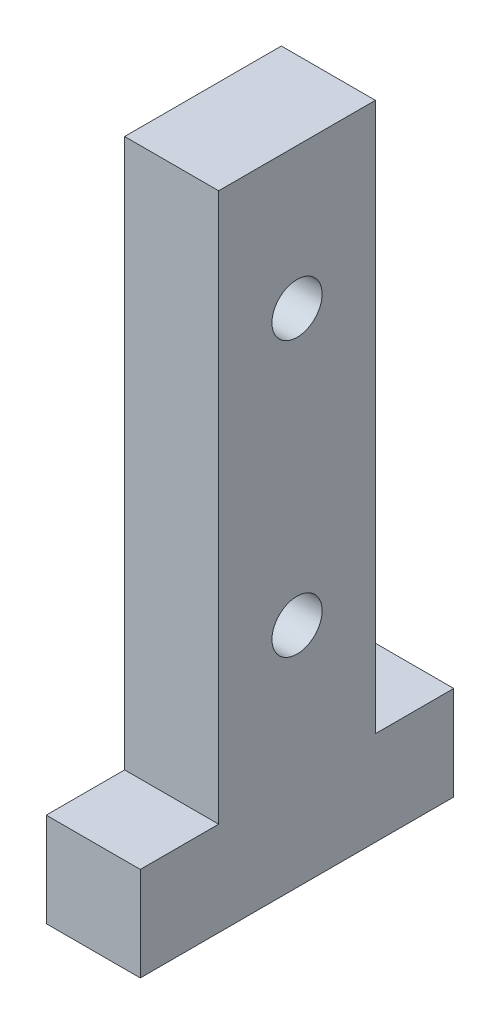
ISO-10303-21;
HEADER;
FILE_DESCRIPTION(('STEP AP214'),'2;1');
FILE_NAME('part.step','',(''),(''),'','','');
FILE_SCHEMA(('AUTOMOTIVE_DESIGN { 1 0 10303 214 1 1 1 1 }'));
ENDSEC;
DATA;
#1=APPLICATION_CONTEXT('core data for automotive mechanical design processes');
#2=APPLICATION_PROTOCOL_DEFINITION('international standard','automotive_design',2000,#1);
#3=PRODUCT_CONTEXT('',#1,'mechanical');
#4=PRODUCT('Part','Part','',(#3));
#5=PRODUCT_RELATED_PRODUCT_CATEGORY('part','',(#4));
#6=PRODUCT_DEFINITION_FORMATION('','',#4);
#7=PRODUCT_DEFINITION_CONTEXT('part definition',#1,'design');
#8=PRODUCT_DEFINITION('design','',#6,#7);
#9=PRODUCT_DEFINITION_SHAPE('','',#8);
#10=(LENGTH_UNIT() NAMED_UNIT(*) SI_UNIT(.MILLI.,.METRE.));
#11=(NAMED_UNIT(*) PLANE_ANGLE_UNIT() SI_UNIT($,.RADIAN.));
#12=(NAMED_UNIT(*) SI_UNIT($,.STERADIAN.) SOLID_ANGLE_UNIT());
#13=UNCERTAINTY_MEASURE_WITH_UNIT(LENGTH_MEASURE(1.E-05),#10,'distance_accuracy_value','');
#14=(GEOMETRIC_REPRESENTATION_CONTEXT(3) GLOBAL_UNCERTAINTY_ASSIGNED_CONTEXT((#13)) GLOBAL_UNIT_ASSIGNED_CONTEXT((#10,
#11,#12)) REPRESENTATION_CONTEXT('',''));
#15=CARTESIAN_POINT('',(0.,0.,0.));
#16=DIRECTION('',(0.,0.,1.));
#17=DIRECTION('',(1.,0.,0.));
#18=AXIS2_PLACEMENT_3D('',#15,#16,#17);
#19=CARTESIAN_POINT('',(6.,0.,0.));
#20=DIRECTION('',(-1.,0.,0.));
#21=DIRECTION('',(0.,0.,1.));
#22=AXIS2_PLACEMENT_3D('',#19,#20,#21);
#23=PLANE('',#22);
#24=DIRECTION('',(0.,-1.,0.));
#25=VECTOR('',#24,1.);
#26=CARTESIAN_POINT('',(6.,0.,10.));
#27=LINE('',#26,#25);
#28=CARTESIAN_POINT('',(6.,6.,10.));
#29=VERTEX_POINT('',#28);
#30=CARTESIAN_POINT('',(6.,0.,10.));
#31=VERTEX_POINT('',#30);
#32=EDGE_CURVE('E170',#29,#31,#27,.T.);
#33=ORIENTED_EDGE('',*,*,#32,.T.);
#34=DIRECTION('',(0.,0.,-1.));
#35=VECTOR('',#34,1.);
#36=CARTESIAN_POINT('',(6.,0.,10.));
#37=LINE('',#36,#35);
#38=CARTESIAN_POINT('',(6.,0.,-10.));
#39=VERTEX_POINT('',#38);
#40=EDGE_CURVE('E106',#31,#39,#37,.T.);
#41=ORIENTED_EDGE('',*,*,#40,.T.);
#42=DIRECTION('',(0.,1.,0.));
#43=VECTOR('',#42,1.);
#44=CARTESIAN_POINT('',(6.,0.,-10.));
#45=LINE('',#44,#43);
#46=CARTESIAN_POINT('',(6.,6.,-10.));
#47=VERTEX_POINT('',#46);
#48=EDGE_CURVE('E191',#39,#47,#45,.T.);
#49=ORIENTED_EDGE('',*,*,#48,.T.);
#50=DIRECTION('',(0.,0.,1.));
#51=VECTOR('',#50,1.);
#52=CARTESIAN_POINT('',(6.,6.,-5.));
#53=LINE('',#52,#51);
#54=CARTESIAN_POINT('',(6.,6.,-5.));
#55=VERTEX_POINT('',#54);
#56=EDGE_CURVE('E205',#47,#55,#53,.T.);
#57=ORIENTED_EDGE('',*,*,#56,.T.);
#58=DIRECTION('',(0.,1.,0.));
#59=VECTOR('',#58,1.);
#60=CARTESIAN_POINT('',(6.,6.,-5.));
#61=LINE('',#60,#59);
#62=CARTESIAN_POINT('',(6.,41.,-5.));
#63=VERTEX_POINT('',#62);
#64=EDGE_CURVE('E125',#55,#63,#61,.T.);
#65=ORIENTED_EDGE('',*,*,#64,.T.);
#66=DIRECTION('',(0.,0.,1.));
#67=VECTOR('',#66,1.);
#68=CARTESIAN_POINT('',(6.,41.,5.));
#69=LINE('',#68,#67);
#70=CARTESIAN_POINT('',(6.,41.,5.));
#71=VERTEX_POINT('',#70);
#72=EDGE_CURVE('E119',#63,#71,#69,.T.);
#73=ORIENTED_EDGE('',*,*,#72,.T.);
#74=DIRECTION('',(0.,-1.,0.));
#75=VECTOR('',#74,1.);
#76=CARTESIAN_POINT('',(6.,6.,5.));
#77=LINE('',#76,#75);
#78=CARTESIAN_POINT('',(6.,6.,5.));
#79=VERTEX_POINT('',#78);
#80=EDGE_CURVE('E123',#71,#79,#77,.T.);
#81=ORIENTED_EDGE('',*,*,#80,.T.);
#82=DIRECTION('',(0.,0.,1.));
#83=VECTOR('',#82,1.);
#84=CARTESIAN_POINT('',(6.,6.,10.));
#85=LINE('',#84,#83);
#86=EDGE_CURVE('E63',#79,#29,#85,.T.);
#87=ORIENTED_EDGE('',*,*,#86,.T.);
#88=EDGE_LOOP('',(#33,#41,#49,#57,#65,#73,#81,#87));
#89=FACE_BOUND('',#88,.T.);
#90=CARTESIAN_POINT('',(6.,32.,1.82231204340011E-13));
#91=DIRECTION('',(1.,0.,0.));
#92=DIRECTION('',(0.,0.,-1.));
#93=AXIS2_PLACEMENT_3D('',#90,#91,#92);
#94=CIRCLE('',#93,1.6);
#95=CARTESIAN_POINT('',(6.,32.,-1.59999999999982));
#96=VERTEX_POINT('',#95);
#97=EDGE_CURVE('E152',#96,#96,#94,.T.);
#98=ORIENTED_EDGE('',*,*,#97,.F.);
#99=EDGE_LOOP('',(#98));
#100=FACE_BOUND('',#99,.T.);
#101=CARTESIAN_POINT('',(6.,14.5,0.));
#102=DIRECTION('',(1.,0.,0.));
#103=DIRECTION('',(0.,0.,-1.));
#104=AXIS2_PLACEMENT_3D('',#101,#102,#103);
#105=CIRCLE('',#104,1.6);
#106=CARTESIAN_POINT('',(6.,14.5,-1.6));
#107=VERTEX_POINT('',#106);
#108=EDGE_CURVE('E219',#107,#107,#105,.T.);
#109=ORIENTED_EDGE('',*,*,#108,.F.);
#110=EDGE_LOOP('',(#109));
#111=FACE_BOUND('',#110,.T.);
#112=ADVANCED_FACE('F45',(#89,#100,#111),#23,.F.);
#113=CARTESIAN_POINT('',(0.,0.,0.));
#114=DIRECTION('',(-1.,0.,0.));
#115=DIRECTION('',(0.,0.,1.));
#116=AXIS2_PLACEMENT_3D('',#113,#114,#115);
#117=PLANE('',#116);
#118=CARTESIAN_POINT('',(0.,32.,1.82231204340011E-13));
#119=DIRECTION('',(1.,0.,0.));
#120=DIRECTION('',(0.,0.,-1.));
#121=AXIS2_PLACEMENT_3D('',#118,#119,#120);
#122=CIRCLE('',#121,1.6);
#123=CARTESIAN_POINT('',(0.,32.,-1.59999999999982));
#124=VERTEX_POINT('',#123);
#125=EDGE_CURVE('E215',#124,#124,#122,.T.);
#126=ORIENTED_EDGE('',*,*,#125,.T.);
#127=EDGE_LOOP('',(#126));
#128=FACE_BOUND('',#127,.T.);
#129=DIRECTION('',(0.,-1.,0.));
#130=VECTOR('',#129,1.);
#131=CARTESIAN_POINT('',(0.,0.,10.));
#132=LINE('',#131,#130);
#133=CARTESIAN_POINT('',(0.,6.,10.));
#134=VERTEX_POINT('',#133);
#135=CARTESIAN_POINT('',(0.,0.,10.));
#136=VERTEX_POINT('',#135);
#137=EDGE_CURVE('E147',#134,#136,#132,.T.);
#138=ORIENTED_EDGE('',*,*,#137,.F.);
#139=DIRECTION('',(0.,0.,1.));
#140=VECTOR('',#139,1.);
#141=CARTESIAN_POINT('',(0.,6.,10.));
#142=LINE('',#141,#140);
#143=CARTESIAN_POINT('',(0.,6.,5.));
#144=VERTEX_POINT('',#143);
#145=EDGE_CURVE('E98',#144,#134,#142,.T.);
#146=ORIENTED_EDGE('',*,*,#145,.F.);
#147=DIRECTION('',(0.,-1.,0.));
#148=VECTOR('',#147,1.);
#149=CARTESIAN_POINT('',(0.,6.,5.));
#150=LINE('',#149,#148);
#151=CARTESIAN_POINT('',(0.,41.,5.));
#152=VERTEX_POINT('',#151);
#153=EDGE_CURVE('E92',#152,#144,#150,.T.);
#154=ORIENTED_EDGE('',*,*,#153,.F.);
#155=DIRECTION('',(0.,0.,1.));
#156=VECTOR('',#155,1.);
#157=CARTESIAN_POINT('',(0.,41.,5.));
#158=LINE('',#157,#156);
#159=CARTESIAN_POINT('',(0.,41.,-5.));
#160=VERTEX_POINT('',#159);
#161=EDGE_CURVE('E134',#160,#152,#158,.T.);
#162=ORIENTED_EDGE('',*,*,#161,.F.);
#163=DIRECTION('',(0.,1.,0.));
#164=VECTOR('',#163,1.);
#165=CARTESIAN_POINT('',(0.,6.,-5.));
#166=LINE('',#165,#164);
#167=CARTESIAN_POINT('',(0.,6.,-5.));
#168=VERTEX_POINT('',#167);
#169=EDGE_CURVE('E161',#168,#160,#166,.T.);
#170=ORIENTED_EDGE('',*,*,#169,.F.);
#171=DIRECTION('',(0.,0.,1.));
#172=VECTOR('',#171,1.);
#173=CARTESIAN_POINT('',(0.,6.,-5.));
#174=LINE('',#173,#172);
#175=CARTESIAN_POINT('',(0.,6.,-10.));
#176=VERTEX_POINT('',#175);
#177=EDGE_CURVE('E158',#176,#168,#174,.T.);
#178=ORIENTED_EDGE('',*,*,#177,.F.);
#179=DIRECTION('',(0.,1.,0.));
#180=VECTOR('',#179,1.);
#181=CARTESIAN_POINT('',(0.,0.,-10.));
#182=LINE('',#181,#180);
#183=CARTESIAN_POINT('',(0.,0.,-10.));
#184=VERTEX_POINT('',#183);
#185=EDGE_CURVE('E155',#184,#176,#182,.T.);
#186=ORIENTED_EDGE('',*,*,#185,.F.);
#187=DIRECTION('',(0.,0.,-1.));
#188=VECTOR('',#187,1.);
#189=CARTESIAN_POINT('',(0.,0.,10.));
#190=LINE('',#189,#188);
#191=EDGE_CURVE('E151',#136,#184,#190,.T.);
#192=ORIENTED_EDGE('',*,*,#191,.F.);
#193=EDGE_LOOP('',(#138,#146,#154,#162,#170,#178,#186,#192));
#194=FACE_BOUND('',#193,.T.);
#195=CARTESIAN_POINT('',(0.,14.5,0.));
#196=DIRECTION('',(1.,0.,0.));
#197=DIRECTION('',(0.,0.,-1.));
#198=AXIS2_PLACEMENT_3D('',#195,#196,#197);
#199=CIRCLE('',#198,1.6);
#200=CARTESIAN_POINT('',(0.,14.5,-1.6));
#201=VERTEX_POINT('',#200);
#202=EDGE_CURVE('E223',#201,#201,#199,.T.);
#203=ORIENTED_EDGE('',*,*,#202,.T.);
#204=EDGE_LOOP('',(#203));
#205=FACE_BOUND('',#204,.T.);
#206=ADVANCED_FACE('F195',(#128,#194,#205),#117,.T.);
#207=CARTESIAN_POINT('',(6.,0.,10.));
#208=DIRECTION('',(0.,0.,-1.));
#209=DIRECTION('',(-1.,0.,0.));
#210=AXIS2_PLACEMENT_3D('',#207,#208,#209);
#211=PLANE('',#210);
#212=ORIENTED_EDGE('',*,*,#137,.T.);
#213=DIRECTION('',(-1.,0.,0.));
#214=VECTOR('',#213,1.);
#215=CARTESIAN_POINT('',(6.,0.,10.));
#216=LINE('',#215,#214);
#217=EDGE_CURVE('E11',#31,#136,#216,.T.);
#218=ORIENTED_EDGE('',*,*,#217,.F.);
#219=ORIENTED_EDGE('',*,*,#32,.F.);
#220=DIRECTION('',(-1.,0.,0.));
#221=VECTOR('',#220,1.);
#222=CARTESIAN_POINT('',(6.,6.,10.));
#223=LINE('',#222,#221);
#224=EDGE_CURVE('E143',#29,#134,#223,.T.);
#225=ORIENTED_EDGE('',*,*,#224,.T.);
#226=EDGE_LOOP('',(#212,#218,#219,#225));
#227=FACE_BOUND('',#226,.T.);
#228=ADVANCED_FACE('F47',(#227),#211,.F.);
#229=CARTESIAN_POINT('',(6.,0.,10.));
#230=DIRECTION('',(0.,1.,0.));
#231=DIRECTION('',(0.,0.,1.));
#232=AXIS2_PLACEMENT_3D('',#229,#230,#231);
#233=PLANE('',#232);
#234=ORIENTED_EDGE('',*,*,#191,.T.);
#235=DIRECTION('',(-1.,0.,0.));
#236=VECTOR('',#235,1.);
#237=CARTESIAN_POINT('',(6.,0.,-10.));
#238=LINE('',#237,#236);
#239=EDGE_CURVE('E55',#39,#184,#238,.T.);
#240=ORIENTED_EDGE('',*,*,#239,.F.);
#241=ORIENTED_EDGE('',*,*,#40,.F.);
#242=ORIENTED_EDGE('',*,*,#217,.T.);
#243=EDGE_LOOP('',(#234,#240,#241,#242));
#244=FACE_BOUND('',#243,.T.);
#245=ADVANCED_FACE('F257',(#244),#233,.F.);
#246=CARTESIAN_POINT('',(6.,0.,-10.));
#247=DIRECTION('',(0.,0.,1.));
#248=DIRECTION('',(1.,0.,0.));
#249=AXIS2_PLACEMENT_3D('',#246,#247,#248);
#250=PLANE('',#249);
#251=ORIENTED_EDGE('',*,*,#185,.T.);
#252=DIRECTION('',(-1.,0.,0.));
#253=VECTOR('',#252,1.);
#254=CARTESIAN_POINT('',(6.,6.,-10.));
#255=LINE('',#254,#253);
#256=EDGE_CURVE('E181',#47,#176,#255,.T.);
#257=ORIENTED_EDGE('',*,*,#256,.F.);
#258=ORIENTED_EDGE('',*,*,#48,.F.);
#259=ORIENTED_EDGE('',*,*,#239,.T.);
#260=EDGE_LOOP('',(#251,#257,#258,#259));
#261=FACE_BOUND('',#260,.T.);
#262=ADVANCED_FACE('F189',(#261),#250,.F.);
#263=CARTESIAN_POINT('',(6.,6.,-5.));
#264=DIRECTION('',(0.,-1.,0.));
#265=DIRECTION('',(0.,0.,-1.));
#266=AXIS2_PLACEMENT_3D('',#263,#264,#265);
#267=PLANE('',#266);
#268=ORIENTED_EDGE('',*,*,#177,.T.);
#269=DIRECTION('',(-1.,0.,0.));
#270=VECTOR('',#269,1.);
#271=CARTESIAN_POINT('',(6.,6.,-5.));
#272=LINE('',#271,#270);
#273=EDGE_CURVE('E177',#55,#168,#272,.T.);
#274=ORIENTED_EDGE('',*,*,#273,.F.);
#275=ORIENTED_EDGE('',*,*,#56,.F.);
#276=ORIENTED_EDGE('',*,*,#256,.T.);
#277=EDGE_LOOP('',(#268,#274,#275,#276));
#278=FACE_BOUND('',#277,.T.);
#279=ADVANCED_FACE('F200',(#278),#267,.F.);
#280=CARTESIAN_POINT('',(6.,6.,-5.));
#281=DIRECTION('',(0.,0.,1.));
#282=DIRECTION('',(1.,0.,0.));
#283=AXIS2_PLACEMENT_3D('',#280,#281,#282);
#284=PLANE('',#283);
#285=ORIENTED_EDGE('',*,*,#169,.T.);
#286=DIRECTION('',(-1.,0.,0.));
#287=VECTOR('',#286,1.);
#288=CARTESIAN_POINT('',(6.,41.,-5.));
#289=LINE('',#288,#287);
#290=EDGE_CURVE('E136',#63,#160,#289,.T.);
#291=ORIENTED_EDGE('',*,*,#290,.F.);
#292=ORIENTED_EDGE('',*,*,#64,.F.);
#293=ORIENTED_EDGE('',*,*,#273,.T.);
#294=EDGE_LOOP('',(#285,#291,#292,#293));
#295=FACE_BOUND('',#294,.T.);
#296=ADVANCED_FACE('F203',(#295),#284,.F.);
#297=CARTESIAN_POINT('',(6.,41.,5.));
#298=DIRECTION('',(0.,-1.,0.));
#299=DIRECTION('',(0.,0.,-1.));
#300=AXIS2_PLACEMENT_3D('',#297,#298,#299);
#301=PLANE('',#300);
#302=ORIENTED_EDGE('',*,*,#161,.T.);
#303=DIRECTION('',(-1.,0.,0.));
#304=VECTOR('',#303,1.);
#305=CARTESIAN_POINT('',(6.,41.,5.));
#306=LINE('',#305,#304);
#307=EDGE_CURVE('E131',#71,#152,#306,.T.);
#308=ORIENTED_EDGE('',*,*,#307,.F.);
#309=ORIENTED_EDGE('',*,*,#72,.F.);
#310=ORIENTED_EDGE('',*,*,#290,.T.);
#311=EDGE_LOOP('',(#302,#308,#309,#310));
#312=FACE_BOUND('',#311,.T.);
#313=ADVANCED_FACE('F132',(#312),#301,.F.);
#314=CARTESIAN_POINT('',(6.,6.,5.));
#315=DIRECTION('',(0.,0.,-1.));
#316=DIRECTION('',(-1.,0.,0.));
#317=AXIS2_PLACEMENT_3D('',#314,#315,#316);
#318=PLANE('',#317);
#319=ORIENTED_EDGE('',*,*,#153,.T.);
#320=DIRECTION('',(-1.,0.,0.));
#321=VECTOR('',#320,1.);
#322=CARTESIAN_POINT('',(6.,6.,5.));
#323=LINE('',#322,#321);
#324=EDGE_CURVE('E137',#79,#144,#323,.T.);
#325=ORIENTED_EDGE('',*,*,#324,.F.);
#326=ORIENTED_EDGE('',*,*,#80,.F.);
#327=ORIENTED_EDGE('',*,*,#307,.T.);
#328=EDGE_LOOP('',(#319,#325,#326,#327));
#329=FACE_BOUND('',#328,.T.);
#330=ADVANCED_FACE('F139',(#329),#318,.F.);
#331=CARTESIAN_POINT('',(6.,6.,10.));
#332=DIRECTION('',(0.,-1.,0.));
#333=DIRECTION('',(0.,0.,-1.));
#334=AXIS2_PLACEMENT_3D('',#331,#332,#333);
#335=PLANE('',#334);
#336=ORIENTED_EDGE('',*,*,#145,.T.);
#337=ORIENTED_EDGE('',*,*,#224,.F.);
#338=ORIENTED_EDGE('',*,*,#86,.F.);
#339=ORIENTED_EDGE('',*,*,#324,.T.);
#340=EDGE_LOOP('',(#336,#337,#338,#339));
#341=FACE_BOUND('',#340,.T.);
#342=ADVANCED_FACE('F245',(#341),#335,.F.);
#343=CARTESIAN_POINT('',(6.,32.,1.82231204340011E-13));
#344=DIRECTION('',(-1.,0.,0.));
#345=DIRECTION('',(0.,0.,1.));
#346=AXIS2_PLACEMENT_3D('',#343,#344,#345);
#347=CYLINDRICAL_SURFACE('',#346,1.6);
#348=ORIENTED_EDGE('',*,*,#97,.T.);
#349=EDGE_LOOP('',(#348));
#350=FACE_BOUND('',#349,.T.);
#351=ORIENTED_EDGE('',*,*,#125,.F.);
#352=EDGE_LOOP('',(#351));
#353=FACE_BOUND('',#352,.T.);
#354=ADVANCED_FACE('F242',(#350,#353),#347,.F.);
#355=CARTESIAN_POINT('',(6.,14.5,0.));
#356=DIRECTION('',(-1.,0.,0.));
#357=DIRECTION('',(0.,0.,1.));
#358=AXIS2_PLACEMENT_3D('',#355,#356,#357);
#359=CYLINDRICAL_SURFACE('',#358,1.6);
#360=ORIENTED_EDGE('',*,*,#108,.T.);
#361=EDGE_LOOP('',(#360));
#362=FACE_BOUND('',#361,.T.);
#363=ORIENTED_EDGE('',*,*,#202,.F.);
#364=EDGE_LOOP('',(#363));
#365=FACE_BOUND('',#364,.T.);
#366=ADVANCED_FACE('F231',(#362,#365),#359,.F.);
#367=CLOSED_SHELL('',(#112,#206,#228,#245,#262,#279,#296,#313,#330,#342,#354,#366));
#368=MANIFOLD_SOLID_BREP('B2',#367);
#369=ADVANCED_BREP_SHAPE_REPRESENTATION('',(#18,#368),#14);
#370=SHAPE_DEFINITION_REPRESENTATION(#9,#369);
ENDSEC;
END-ISO-10303-21;
